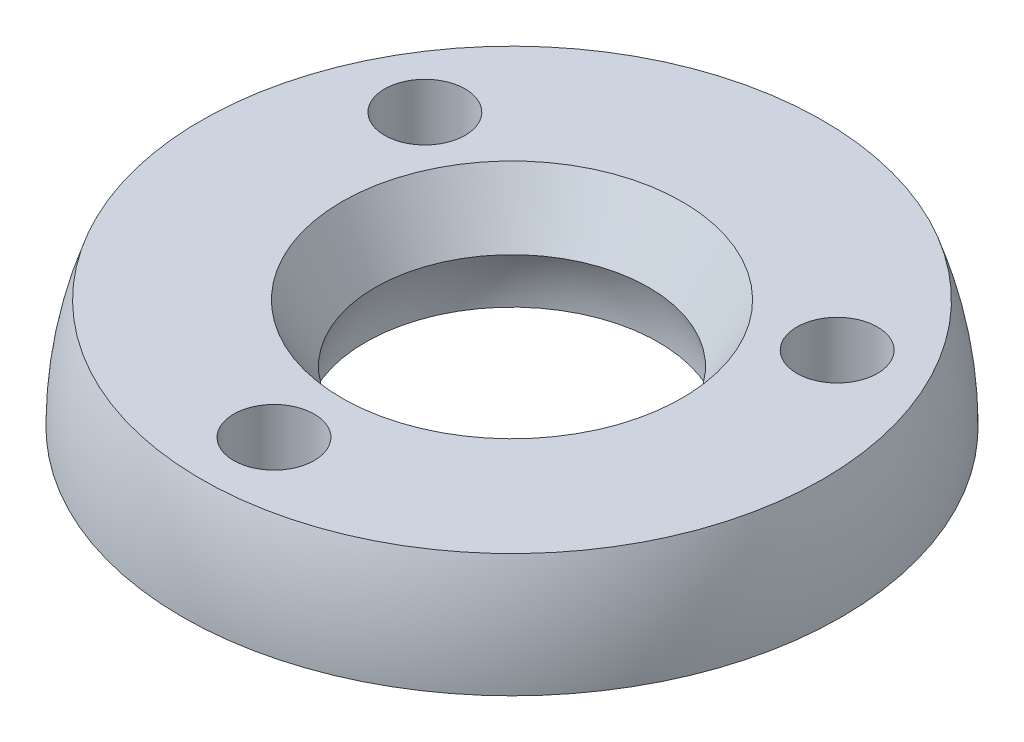
ISO-10303-21;
HEADER;
FILE_DESCRIPTION(('STEP AP214'),'2;1');
FILE_NAME('part.step','',(''),(''),'','','');
FILE_SCHEMA(('AUTOMOTIVE_DESIGN { 1 0 10303 214 1 1 1 1 }'));
ENDSEC;
DATA;
#1=APPLICATION_CONTEXT('core data for automotive mechanical design processes');
#2=APPLICATION_PROTOCOL_DEFINITION('international standard','automotive_design',2000,#1);
#3=PRODUCT_CONTEXT('',#1,'mechanical');
#4=PRODUCT('Part','Part','',(#3));
#5=PRODUCT_RELATED_PRODUCT_CATEGORY('part','',(#4));
#6=PRODUCT_DEFINITION_FORMATION('','',#4);
#7=PRODUCT_DEFINITION_CONTEXT('part definition',#1,'design');
#8=PRODUCT_DEFINITION('design','',#6,#7);
#9=PRODUCT_DEFINITION_SHAPE('','',#8);
#10=(LENGTH_UNIT() NAMED_UNIT(*) SI_UNIT(.MILLI.,.METRE.));
#11=(NAMED_UNIT(*) PLANE_ANGLE_UNIT() SI_UNIT($,.RADIAN.));
#12=(NAMED_UNIT(*) SI_UNIT($,.STERADIAN.) SOLID_ANGLE_UNIT());
#13=UNCERTAINTY_MEASURE_WITH_UNIT(LENGTH_MEASURE(1.E-05),#10,'distance_accuracy_value','');
#14=(GEOMETRIC_REPRESENTATION_CONTEXT(3) GLOBAL_UNCERTAINTY_ASSIGNED_CONTEXT((#13)) GLOBAL_UNIT_ASSIGNED_CONTEXT((#10,
#11,#12)) REPRESENTATION_CONTEXT('',''));
#15=CARTESIAN_POINT('',(0.,0.,0.));
#16=DIRECTION('',(0.,0.,1.));
#17=DIRECTION('',(1.,0.,0.));
#18=AXIS2_PLACEMENT_3D('',#15,#16,#17);
#19=CARTESIAN_POINT('',(0.,3.,0.));
#20=DIRECTION('',(0.,-1.,0.));
#21=DIRECTION('',(1.,0.,0.));
#22=AXIS2_PLACEMENT_3D('',#19,#20,#21);
#23=PLANE('',#22);
#24=CARTESIAN_POINT('',(0.,3.,6.5));
#25=DIRECTION('',(0.,-1.,0.));
#26=DIRECTION('',(1.,0.,0.));
#27=AXIS2_PLACEMENT_3D('',#24,#25,#26);
#28=CIRCLE('',#27,1.1);
#29=CARTESIAN_POINT('',(1.10000000000002,2.99999999999999,6.5));
#30=VERTEX_POINT('',#29);
#31=EDGE_CURVE('E77',#30,#30,#28,.T.);
#32=ORIENTED_EDGE('',*,*,#31,.T.);
#33=EDGE_LOOP('',(#32));
#34=FACE_BOUND('',#33,.T.);
#35=CARTESIAN_POINT('',(5.62916512459886,2.99999999999996,-3.24999999999977));
#36=DIRECTION('',(0.,-1.,0.));
#37=DIRECTION('',(1.,0.,0.));
#38=AXIS2_PLACEMENT_3D('',#35,#36,#37);
#39=CIRCLE('',#38,1.1);
#40=CARTESIAN_POINT('',(6.72916512459887,2.99999999999995,-3.24999999999977));
#41=VERTEX_POINT('',#40);
#42=EDGE_CURVE('E81',#41,#41,#39,.T.);
#43=ORIENTED_EDGE('',*,*,#42,.T.);
#44=EDGE_LOOP('',(#43));
#45=FACE_BOUND('',#44,.T.);
#46=CARTESIAN_POINT('',(-5.62916512459863,3.00000000000004,-3.24999999999988));
#47=DIRECTION('',(0.,-1.,0.));
#48=DIRECTION('',(1.,0.,0.));
#49=AXIS2_PLACEMENT_3D('',#46,#47,#48);
#50=CIRCLE('',#49,1.09999999999999);
#51=CARTESIAN_POINT('',(-4.52916512459864,3.00000000000003,-3.24999999999988));
#52=VERTEX_POINT('',#51);
#53=EDGE_CURVE('E85',#52,#52,#50,.T.);
#54=ORIENTED_EDGE('',*,*,#53,.T.);
#55=EDGE_LOOP('',(#54));
#56=FACE_BOUND('',#55,.T.);
#57=CARTESIAN_POINT('',(0.,3.,0.));
#58=DIRECTION('',(0.,-1.,0.));
#59=DIRECTION('',(1.,0.,0.));
#60=AXIS2_PLACEMENT_3D('',#57,#58,#59);
#61=CIRCLE('',#60,4.6457513110646);
#62=CARTESIAN_POINT('',(-4.64575131106457,3.00000000000003,0.));
#63=VERTEX_POINT('',#62);
#64=EDGE_CURVE('E57',#63,#63,#61,.T.);
#65=ORIENTED_EDGE('',*,*,#64,.T.);
#66=EDGE_LOOP('',(#65));
#67=FACE_BOUND('',#66,.T.);
#68=CARTESIAN_POINT('',(0.,3.,0.));
#69=DIRECTION('',(0.,-1.,0.));
#70=DIRECTION('',(1.,0.,0.));
#71=AXIS2_PLACEMENT_3D('',#68,#69,#70);
#72=CIRCLE('',#71,8.48528137423857);
#73=CARTESIAN_POINT('',(8.48528137423859,2.99999999999994,0.));
#74=VERTEX_POINT('',#73);
#75=EDGE_CURVE('E62',#74,#74,#72,.T.);
#76=ORIENTED_EDGE('',*,*,#75,.F.);
#77=EDGE_LOOP('',(#76));
#78=FACE_BOUND('',#77,.T.);
#79=ADVANCED_FACE('F48',(#34,#45,#56,#67,#78),#23,.F.);
#80=CARTESIAN_POINT('',(0.,0.,0.));
#81=DIRECTION('',(0.,-1.,0.));
#82=DIRECTION('',(0.,0.,1.));
#83=AXIS2_PLACEMENT_3D('',#80,#81,#82);
#84=PLANE('',#83);
#85=CARTESIAN_POINT('',(0.,0.,6.5));
#86=DIRECTION('',(0.,-1.,0.));
#87=DIRECTION('',(1.,0.,0.));
#88=AXIS2_PLACEMENT_3D('',#85,#86,#87);
#89=CIRCLE('',#88,1.1);
#90=CARTESIAN_POINT('',(1.1,0.,6.5));
#91=VERTEX_POINT('',#90);
#92=EDGE_CURVE('E89',#91,#91,#89,.T.);
#93=ORIENTED_EDGE('',*,*,#92,.F.);
#94=EDGE_LOOP('',(#93));
#95=FACE_BOUND('',#94,.T.);
#96=CARTESIAN_POINT('',(5.62916512459884,0.,-3.24999999999977));
#97=DIRECTION('',(0.,-1.,0.));
#98=DIRECTION('',(1.,0.,0.));
#99=AXIS2_PLACEMENT_3D('',#96,#97,#98);
#100=CIRCLE('',#99,1.1);
#101=CARTESIAN_POINT('',(6.72916512459884,0.,-3.24999999999977));
#102=VERTEX_POINT('',#101);
#103=EDGE_CURVE('E94',#102,#102,#100,.T.);
#104=ORIENTED_EDGE('',*,*,#103,.F.);
#105=EDGE_LOOP('',(#104));
#106=FACE_BOUND('',#105,.T.);
#107=CARTESIAN_POINT('',(-5.62916512459866,0.,-3.24999999999988));
#108=DIRECTION('',(0.,-1.,0.));
#109=DIRECTION('',(1.,0.,0.));
#110=AXIS2_PLACEMENT_3D('',#107,#108,#109);
#111=CIRCLE('',#110,1.09999999999999);
#112=CARTESIAN_POINT('',(-4.52916512459866,0.,-3.24999999999988));
#113=VERTEX_POINT('',#112);
#114=EDGE_CURVE('E90',#113,#113,#111,.T.);
#115=ORIENTED_EDGE('',*,*,#114,.F.);
#116=EDGE_LOOP('',(#115));
#117=FACE_BOUND('',#116,.T.);
#118=CARTESIAN_POINT('',(0.,0.,0.));
#119=DIRECTION('',(0.,-1.,0.));
#120=DIRECTION('',(0.,0.,1.));
#121=AXIS2_PLACEMENT_3D('',#118,#119,#120);
#122=CIRCLE('',#121,4.);
#123=CARTESIAN_POINT('',(0.,0.,4.));
#124=VERTEX_POINT('',#123);
#125=EDGE_CURVE('E67',#124,#124,#122,.T.);
#126=ORIENTED_EDGE('',*,*,#125,.F.);
#127=EDGE_LOOP('',(#126));
#128=FACE_BOUND('',#127,.T.);
#129=CARTESIAN_POINT('',(0.,0.,0.));
#130=DIRECTION('',(0.,-1.,0.));
#131=DIRECTION('',(0.,0.,1.));
#132=AXIS2_PLACEMENT_3D('',#129,#130,#131);
#133=CIRCLE('',#132,9.);
#134=CARTESIAN_POINT('',(0.,0.,9.));
#135=VERTEX_POINT('',#134);
#136=EDGE_CURVE('E73',#135,#135,#133,.T.);
#137=ORIENTED_EDGE('',*,*,#136,.T.);
#138=EDGE_LOOP('',(#137));
#139=FACE_BOUND('',#138,.T.);
#140=ADVANCED_FACE('F105',(#95,#106,#117,#128,#139),#84,.T.);
#141=CARTESIAN_POINT('',(0.,0.,0.));
#142=DIRECTION('',(0.,0.,1.));
#143=DIRECTION('',(-1.,0.,0.));
#144=AXIS2_PLACEMENT_3D('',#141,#142,#143);
#145=SPHERICAL_SURFACE('',#144,4.);
#146=CARTESIAN_POINT('',(0.,0.,0.));
#147=DIRECTION('',(0.,-1.,0.));
#148=DIRECTION('',(1.,0.,0.));
#149=AXIS2_PLACEMENT_3D('',#146,#147,#148);
#150=SPHERICAL_SURFACE('',#149,4.);
#151=CARTESIAN_POINT('',(0.,1.42618697889626,0.));
#152=DIRECTION('',(0.,-1.,0.));
#153=DIRECTION('',(1.,0.,0.));
#154=AXIS2_PLACEMENT_3D('',#151,#152,#153);
#155=CIRCLE('',#154,3.73710993967621);
#156=CARTESIAN_POINT('',(-3.7371099396762,1.42618697889629,0.));
#157=VERTEX_POINT('',#156);
#158=EDGE_CURVE('E11',#157,#157,#155,.F.);
#159=ORIENTED_EDGE('',*,*,#158,.T.);
#160=EDGE_LOOP('',(#159));
#161=FACE_BOUND('',#160,.T.);
#162=ORIENTED_EDGE('',*,*,#125,.T.);
#163=EDGE_LOOP('',(#162));
#164=FACE_BOUND('',#163,.T.);
#165=ADVANCED_FACE('F108',(#161,#164),#150,.F.);
#166=CARTESIAN_POINT('',(0.,0.,0.));
#167=DIRECTION('',(0.,0.,1.));
#168=DIRECTION('',(-1.,0.,0.));
#169=AXIS2_PLACEMENT_3D('',#166,#167,#168);
#170=SPHERICAL_SURFACE('',#169,9.);
#171=CARTESIAN_POINT('',(0.,0.,0.));
#172=DIRECTION('',(0.,-1.,0.));
#173=DIRECTION('',(1.,0.,0.));
#174=AXIS2_PLACEMENT_3D('',#171,#172,#173);
#175=SPHERICAL_SURFACE('',#174,9.);
#176=ORIENTED_EDGE('',*,*,#75,.T.);
#177=EDGE_LOOP('',(#176));
#178=FACE_BOUND('',#177,.T.);
#179=ORIENTED_EDGE('',*,*,#136,.F.);
#180=EDGE_LOOP('',(#179));
#181=FACE_BOUND('',#180,.T.);
#182=ADVANCED_FACE('F118',(#178,#181),#175,.T.);
#183=CARTESIAN_POINT('',(0.,3.,0.));
#184=DIRECTION('',(0.,1.,0.));
#185=DIRECTION('',(-1.,0.,0.));
#186=AXIS2_PLACEMENT_3D('',#183,#184,#185);
#187=CONICAL_SURFACE('',#186,4.6457513110646,0.5235987755983);
#188=CARTESIAN_POINT('',(-3.7371099396762,1.42618697889629,0.));
#189=CARTESIAN_POINT('',(-3.74657495396149,1.44258086453279,0.));
#190=CARTESIAN_POINT('',(-3.75603996824679,1.45897475016928,0.));
#191=CARTESIAN_POINT('',(-3.77496999681738,1.49176252144228,0.));
#192=CARTESIAN_POINT('',(-3.78443501110268,1.50815640707878,0.));
#193=CARTESIAN_POINT('',(-3.80336503967327,1.54094417835177,0.));
#194=CARTESIAN_POINT('',(-3.81283005395856,1.55733806398827,0.));
#195=CARTESIAN_POINT('',(-3.83176008252915,1.59012583526126,0.));
#196=CARTESIAN_POINT('',(-3.84122509681445,1.60651972089776,0.));
#197=CARTESIAN_POINT('',(-3.86015512538504,1.63930749217075,0.));
#198=CARTESIAN_POINT('',(-3.86962013967034,1.65570137780725,0.));
#199=CARTESIAN_POINT('',(-3.88855016824093,1.68848914908025,0.));
#200=CARTESIAN_POINT('',(-3.89801518252622,1.70488303471674,0.));
#201=CARTESIAN_POINT('',(-3.91694521109681,1.73767080598974,0.));
#202=CARTESIAN_POINT('',(-3.92641022538211,1.75406469162624,0.));
#203=CARTESIAN_POINT('',(-3.9453402539527,1.78685246289923,0.));
#204=CARTESIAN_POINT('',(-3.954805268238,1.80324634853573,0.));
#205=CARTESIAN_POINT('',(-3.97373529680859,1.83603411980872,0.));
#206=CARTESIAN_POINT('',(-3.98320031109388,1.85242800544522,0.));
#207=CARTESIAN_POINT('',(-4.00213033966447,1.88521577671821,0.));
#208=CARTESIAN_POINT('',(-4.01159535394977,1.90160966235471,0.));
#209=CARTESIAN_POINT('',(-4.03052538252036,1.93439743362771,0.));
#210=CARTESIAN_POINT('',(-4.03999039680566,1.9507913192642,0.));
#211=CARTESIAN_POINT('',(-4.05892042537625,1.9835790905372,0.));
#212=CARTESIAN_POINT('',(-4.06838543966154,1.9999729761737,0.));
#213=CARTESIAN_POINT('',(-4.08731546823213,2.03276074744669,0.));
#214=CARTESIAN_POINT('',(-4.09678048251743,2.04915463308319,0.));
#215=CARTESIAN_POINT('',(-4.11571051108802,2.08194240435618,0.));
#216=CARTESIAN_POINT('',(-4.12517552537332,2.09833628999268,0.));
#217=CARTESIAN_POINT('',(-4.14410555394391,2.13112406126567,0.));
#218=CARTESIAN_POINT('',(-4.1535705682292,2.14751794690217,0.));
#219=CARTESIAN_POINT('',(-4.17250059679979,2.18030571817517,0.));
#220=CARTESIAN_POINT('',(-4.18196561108509,2.19669960381166,0.));
#221=CARTESIAN_POINT('',(-4.20089563965568,2.22948737508466,0.));
#222=CARTESIAN_POINT('',(-4.21036065394098,2.24588126072116,0.));
#223=CARTESIAN_POINT('',(-4.22929068251157,2.27866903199415,0.));
#224=CARTESIAN_POINT('',(-4.23875569679686,2.29506291763065,0.));
#225=CARTESIAN_POINT('',(-4.25768572536745,2.32785068890364,0.));
#226=CARTESIAN_POINT('',(-4.26715073965275,2.34424457454014,0.));
#227=CARTESIAN_POINT('',(-4.28608076822334,2.37703234581313,0.));
#228=CARTESIAN_POINT('',(-4.29554578250864,2.39342623144963,0.));
#229=CARTESIAN_POINT('',(-4.31447581107923,2.42621400272263,0.));
#230=CARTESIAN_POINT('',(-4.32394082536452,2.44260788835912,0.));
#231=CARTESIAN_POINT('',(-4.34287085393511,2.47539565963212,0.));
#232=CARTESIAN_POINT('',(-4.35233586822041,2.49178954526862,0.));
#233=CARTESIAN_POINT('',(-4.371265896791,2.52457731654161,0.));
#234=CARTESIAN_POINT('',(-4.3807309110763,2.54097120217811,0.));
#235=CARTESIAN_POINT('',(-4.39966093964689,2.5737589734511,0.));
#236=CARTESIAN_POINT('',(-4.40912595393218,2.5901528590876,0.));
#237=CARTESIAN_POINT('',(-4.42805598250277,2.62294063036059,0.));
#238=CARTESIAN_POINT('',(-4.43752099678807,2.63933451599709,0.));
#239=CARTESIAN_POINT('',(-4.45645102535866,2.67212228727009,0.));
#240=CARTESIAN_POINT('',(-4.46591603964395,2.68851617290658,0.));
#241=CARTESIAN_POINT('',(-4.48484606821455,2.72130394417958,0.));
#242=CARTESIAN_POINT('',(-4.49431108249984,2.73769782981608,0.));
#243=CARTESIAN_POINT('',(-4.51324111107043,2.77048560108907,0.));
#244=CARTESIAN_POINT('',(-4.52270612535573,2.78687948672557,0.));
#245=CARTESIAN_POINT('',(-4.54163615392632,2.81966725799856,0.));
#246=CARTESIAN_POINT('',(-4.55110116821161,2.83606114363506,0.));
#247=CARTESIAN_POINT('',(-4.57003119678221,2.86884891490805,0.));
#248=CARTESIAN_POINT('',(-4.5794962110675,2.88524280054455,0.));
#249=CARTESIAN_POINT('',(-4.59842623963809,2.91803057181755,0.));
#250=CARTESIAN_POINT('',(-4.60789125392339,2.93442445745404,0.));
#251=CARTESIAN_POINT('',(-4.62682128249398,2.96721222872704,0.));
#252=CARTESIAN_POINT('',(-4.63628629677927,2.98360611436354,0.));
#253=CARTESIAN_POINT('',(-4.64575131106457,3.00000000000003,0.));
#254=B_SPLINE_CURVE_WITH_KNOTS('',3,(#188,#189,#190,#191,#192,#193,#194,#195,#196,#197,#198,
#199,#200,#201,#202,#203,#204,#205,#206,#207,#208,#209,#210,#211,#212,#213,#214,#215,#216,#217,
#218,#219,#220,#221,#222,#223,#224,#225,#226,#227,#228,#229,#230,#231,#232,#233,#234,#235,#236,
#237,#238,#239,#240,#241,#242,#243,#244,#245,#246,#247,#248,#249,#250,#251,#252,#253),
.UNSPECIFIED.,.F.,.F.,(4,2,2,2,2,2,2,2,2,2,2,2,2,2,2,2,2,2,2,2,2,2,2,2,2,2,2,2,2,2,2,2,4),(0.,
0.0567900857117742,0.113580171423548,0.170370257135322,0.227160342847095,0.283950428558869,
0.340740514270643,0.397530599982417,0.454320685694191,0.511110771405964,0.567900857117739,
0.624690942829512,0.681481028541286,0.73827111425306,0.795061199964833,0.851851285676607,
0.908641371388381,0.965431457100155,1.02222154281193,1.0790116285237,1.13580171423548,
1.19259179994725,1.24938188565902,1.3061719713708,1.36296205708257,1.41975214279435,
1.47654222850612,1.53333231421789,1.59012239992967,1.64691248564144,1.70370257135321,
1.76049265706499,1.81728274277676),.UNSPECIFIED.);
#255=EDGE_CURVE('BSEAM51',#157,#63,#254,.T.);
#256=ORIENTED_EDGE('',*,*,#158,.F.);
#257=ORIENTED_EDGE('',*,*,#64,.F.);
#258=ORIENTED_EDGE('',*,*,#255,.T.);
#259=ORIENTED_EDGE('',*,*,#255,.F.);
#260=EDGE_LOOP('',(#256,#258,#257,#259));
#261=FACE_BOUND('',#260,.T.);
#262=ADVANCED_FACE('F51',(#261),#187,.F.);
#263=CARTESIAN_POINT('',(-5.62916512459859,10.,-3.24999999999988));
#264=DIRECTION('',(0.,-1.,0.));
#265=DIRECTION('',(1.,0.,0.));
#266=AXIS2_PLACEMENT_3D('',#263,#264,#265);
#267=CYLINDRICAL_SURFACE('',#266,1.09999999999999);
#268=ORIENTED_EDGE('',*,*,#114,.T.);
#269=EDGE_LOOP('',(#268));
#270=FACE_BOUND('',#269,.T.);
#271=ORIENTED_EDGE('',*,*,#53,.F.);
#272=EDGE_LOOP('',(#271));
#273=FACE_BOUND('',#272,.T.);
#274=ADVANCED_FACE('F126',(#270,#273),#267,.F.);
#275=CARTESIAN_POINT('',(5.62916512459891,9.99999999999996,-3.24999999999977));
#276=DIRECTION('',(0.,-1.,0.));
#277=DIRECTION('',(1.,0.,0.));
#278=AXIS2_PLACEMENT_3D('',#275,#276,#277);
#279=CYLINDRICAL_SURFACE('',#278,1.1);
#280=ORIENTED_EDGE('',*,*,#103,.T.);
#281=EDGE_LOOP('',(#280));
#282=FACE_BOUND('',#281,.T.);
#283=ORIENTED_EDGE('',*,*,#42,.F.);
#284=EDGE_LOOP('',(#283));
#285=FACE_BOUND('',#284,.T.);
#286=ADVANCED_FACE('F142',(#282,#285),#279,.F.);
#287=CARTESIAN_POINT('',(0.,10.,6.5));
#288=DIRECTION('',(0.,-1.,0.));
#289=DIRECTION('',(1.,0.,0.));
#290=AXIS2_PLACEMENT_3D('',#287,#288,#289);
#291=CYLINDRICAL_SURFACE('',#290,1.1);
#292=ORIENTED_EDGE('',*,*,#92,.T.);
#293=EDGE_LOOP('',(#292));
#294=FACE_BOUND('',#293,.T.);
#295=ORIENTED_EDGE('',*,*,#31,.F.);
#296=EDGE_LOOP('',(#295));
#297=FACE_BOUND('',#296,.T.);
#298=ADVANCED_FACE('F102',(#294,#297),#291,.F.);
#299=CLOSED_SHELL('',(#79,#140,#165,#182,#262,#274,#286,#298));
#300=MANIFOLD_SOLID_BREP('B2',#299);
#301=ADVANCED_BREP_SHAPE_REPRESENTATION('',(#18,#300),#14);
#302=SHAPE_DEFINITION_REPRESENTATION(#9,#301);
ENDSEC;
END-ISO-10303-21;
